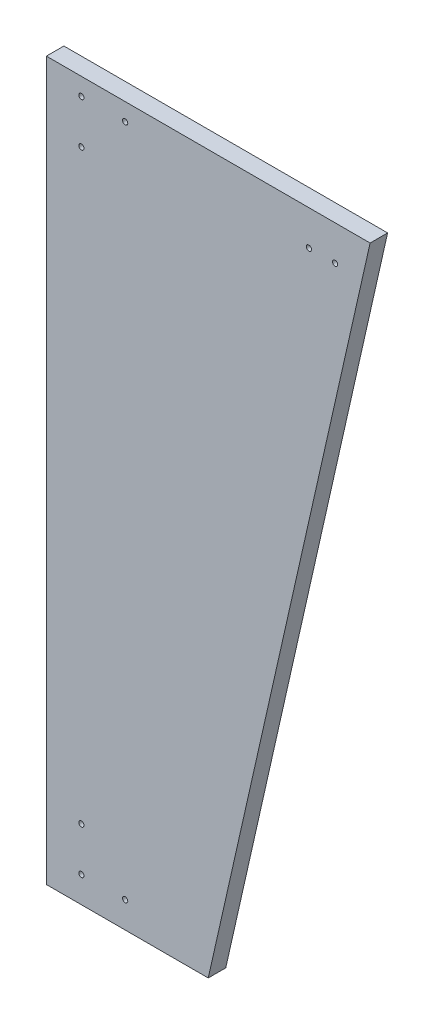
ISO-10303-21;
HEADER;
FILE_DESCRIPTION(('STEP AP214'),'2;1');
FILE_NAME('part.step','',(''),(''),'','','');
FILE_SCHEMA(('AUTOMOTIVE_DESIGN { 1 0 10303 214 1 1 1 1 }'));
ENDSEC;
DATA;
#1=APPLICATION_CONTEXT('core data for automotive mechanical design processes');
#2=APPLICATION_PROTOCOL_DEFINITION('international standard','automotive_design',2000,#1);
#3=PRODUCT_CONTEXT('',#1,'mechanical');
#4=PRODUCT('Part','Part','',(#3));
#5=PRODUCT_RELATED_PRODUCT_CATEGORY('part','',(#4));
#6=PRODUCT_DEFINITION_FORMATION('','',#4);
#7=PRODUCT_DEFINITION_CONTEXT('part definition',#1,'design');
#8=PRODUCT_DEFINITION('design','',#6,#7);
#9=PRODUCT_DEFINITION_SHAPE('','',#8);
#10=(LENGTH_UNIT() NAMED_UNIT(*) SI_UNIT(.MILLI.,.METRE.));
#11=(NAMED_UNIT(*) PLANE_ANGLE_UNIT() SI_UNIT($,.RADIAN.));
#12=(NAMED_UNIT(*) SI_UNIT($,.STERADIAN.) SOLID_ANGLE_UNIT());
#13=UNCERTAINTY_MEASURE_WITH_UNIT(LENGTH_MEASURE(1.E-05),#10,'distance_accuracy_value','');
#14=(GEOMETRIC_REPRESENTATION_CONTEXT(3) GLOBAL_UNCERTAINTY_ASSIGNED_CONTEXT((#13)) GLOBAL_UNIT_ASSIGNED_CONTEXT((#10,
#11,#12)) REPRESENTATION_CONTEXT('',''));
#15=CARTESIAN_POINT('',(0.,0.,0.));
#16=DIRECTION('',(0.,0.,1.));
#17=DIRECTION('',(1.,0.,0.));
#18=AXIS2_PLACEMENT_3D('',#15,#16,#17);
#19=CARTESIAN_POINT('',(0.,-410.,10.));
#20=DIRECTION('',(0.,1.,0.));
#21=DIRECTION('',(0.,0.,1.));
#22=AXIS2_PLACEMENT_3D('',#19,#20,#21);
#23=PLANE('',#22);
#24=DIRECTION('',(1.,0.,0.));
#25=VECTOR('',#24,1.);
#26=CARTESIAN_POINT('',(0.,-410.,0.));
#27=LINE('',#26,#25);
#28=CARTESIAN_POINT('',(-1.95821023183662E-12,-410.,0.));
#29=VERTEX_POINT('',#28);
#30=CARTESIAN_POINT('',(92.5,-410.,0.));
#31=VERTEX_POINT('',#30);
#32=EDGE_CURVE('E103',#29,#31,#27,.T.);
#33=ORIENTED_EDGE('',*,*,#32,.T.);
#34=DIRECTION('',(0.,0.,-1.));
#35=VECTOR('',#34,1.);
#36=CARTESIAN_POINT('',(92.5,-410.,10.));
#37=LINE('',#36,#35);
#38=CARTESIAN_POINT('',(92.5,-410.,10.));
#39=VERTEX_POINT('',#38);
#40=EDGE_CURVE('E11',#39,#31,#37,.T.);
#41=ORIENTED_EDGE('',*,*,#40,.F.);
#42=DIRECTION('',(1.,0.,0.));
#43=VECTOR('',#42,1.);
#44=CARTESIAN_POINT('',(0.,-410.,10.));
#45=LINE('',#44,#43);
#46=CARTESIAN_POINT('',(-1.95821023183662E-12,-410.,10.));
#47=VERTEX_POINT('',#46);
#48=EDGE_CURVE('E88',#47,#39,#45,.T.);
#49=ORIENTED_EDGE('',*,*,#48,.F.);
#50=DIRECTION('',(0.,0.,-1.));
#51=VECTOR('',#50,1.);
#52=CARTESIAN_POINT('',(-1.95821023183662E-12,-410.,10.));
#53=LINE('',#52,#51);
#54=EDGE_CURVE('E99',#47,#29,#53,.T.);
#55=ORIENTED_EDGE('',*,*,#54,.T.);
#56=EDGE_LOOP('',(#33,#41,#49,#55));
#57=FACE_BOUND('',#56,.T.);
#58=ADVANCED_FACE('F41',(#57),#23,.F.);
#59=CARTESIAN_POINT('',(176.039624977888,-39.7162568547674,10.));
#60=DIRECTION('',(-0.97548220917709,0.220078303289953,0.));
#61=DIRECTION('',(-0.220078303289953,-0.97548220917709,0.));
#62=AXIS2_PLACEMENT_3D('',#59,#60,#61);
#63=PLANE('',#62);
#64=DIRECTION('',(0.220078303289953,0.97548220917709,0.));
#65=VECTOR('',#64,1.);
#66=CARTESIAN_POINT('',(176.039624977888,-39.7162568547674,0.));
#67=LINE('',#66,#65);
#68=CARTESIAN_POINT('',(185.,0.,0.));
#69=VERTEX_POINT('',#68);
#70=EDGE_CURVE('E93',#31,#69,#67,.T.);
#71=ORIENTED_EDGE('',*,*,#70,.T.);
#72=DIRECTION('',(0.,0.,-1.));
#73=VECTOR('',#72,1.);
#74=CARTESIAN_POINT('',(185.,0.,10.));
#75=LINE('',#74,#73);
#76=CARTESIAN_POINT('',(185.,0.,10.));
#77=VERTEX_POINT('',#76);
#78=EDGE_CURVE('E49',#77,#69,#75,.T.);
#79=ORIENTED_EDGE('',*,*,#78,.F.);
#80=DIRECTION('',(0.220078303289953,0.97548220917709,0.));
#81=VECTOR('',#80,1.);
#82=CARTESIAN_POINT('',(176.039624977888,-39.7162568547674,10.));
#83=LINE('',#82,#81);
#84=EDGE_CURVE('E83',#39,#77,#83,.T.);
#85=ORIENTED_EDGE('',*,*,#84,.F.);
#86=ORIENTED_EDGE('',*,*,#40,.T.);
#87=EDGE_LOOP('',(#71,#79,#85,#86));
#88=FACE_BOUND('',#87,.T.);
#89=ADVANCED_FACE('F92',(#88),#63,.F.);
#90=CARTESIAN_POINT('',(0.,0.,10.));
#91=DIRECTION('',(0.,1.,0.));
#92=DIRECTION('',(0.,0.,1.));
#93=AXIS2_PLACEMENT_3D('',#90,#91,#92);
#94=PLANE('',#93);
#95=DIRECTION('',(1.,0.,0.));
#96=VECTOR('',#95,1.);
#97=CARTESIAN_POINT('',(0.,0.,0.));
#98=LINE('',#97,#96);
#99=CARTESIAN_POINT('',(0.,0.,0.));
#100=VERTEX_POINT('',#99);
#101=EDGE_CURVE('E108',#100,#69,#98,.T.);
#102=ORIENTED_EDGE('',*,*,#101,.F.);
#103=DIRECTION('',(0.,0.,-1.));
#104=VECTOR('',#103,1.);
#105=CARTESIAN_POINT('',(0.,0.,10.));
#106=LINE('',#105,#104);
#107=CARTESIAN_POINT('',(0.,0.,10.));
#108=VERTEX_POINT('',#107);
#109=EDGE_CURVE('E73',#108,#100,#106,.T.);
#110=ORIENTED_EDGE('',*,*,#109,.F.);
#111=DIRECTION('',(1.,0.,0.));
#112=VECTOR('',#111,1.);
#113=CARTESIAN_POINT('',(0.,0.,10.));
#114=LINE('',#113,#112);
#115=EDGE_CURVE('E86',#108,#77,#114,.T.);
#116=ORIENTED_EDGE('',*,*,#115,.T.);
#117=ORIENTED_EDGE('',*,*,#78,.T.);
#118=EDGE_LOOP('',(#102,#110,#116,#117));
#119=FACE_BOUND('',#118,.T.);
#120=ADVANCED_FACE('F97',(#119),#94,.T.);
#121=CARTESIAN_POINT('',(0.,0.,10.));
#122=DIRECTION('',(1.,0.,0.));
#123=DIRECTION('',(0.,1.,0.));
#124=AXIS2_PLACEMENT_3D('',#121,#122,#123);
#125=PLANE('',#124);
#126=DIRECTION('',(0.,-1.,0.));
#127=VECTOR('',#126,1.);
#128=CARTESIAN_POINT('',(0.,0.,0.));
#129=LINE('',#128,#127);
#130=EDGE_CURVE('E76',#100,#29,#129,.T.);
#131=ORIENTED_EDGE('',*,*,#130,.T.);
#132=ORIENTED_EDGE('',*,*,#54,.F.);
#133=DIRECTION('',(0.,-1.,0.));
#134=VECTOR('',#133,1.);
#135=CARTESIAN_POINT('',(0.,0.,10.));
#136=LINE('',#135,#134);
#137=EDGE_CURVE('E57',#108,#47,#136,.T.);
#138=ORIENTED_EDGE('',*,*,#137,.F.);
#139=ORIENTED_EDGE('',*,*,#109,.T.);
#140=EDGE_LOOP('',(#131,#132,#138,#139));
#141=FACE_BOUND('',#140,.T.);
#142=ADVANCED_FACE('F128',(#141),#125,.F.);
#143=CARTESIAN_POINT('',(0.,0.,10.));
#144=DIRECTION('',(0.,0.,1.));
#145=DIRECTION('',(1.,0.,0.));
#146=AXIS2_PLACEMENT_3D('',#143,#144,#145);
#147=PLANE('',#146);
#148=CARTESIAN_POINT('',(165.,-20.,10.));
#149=DIRECTION('',(0.,0.,-1.));
#150=DIRECTION('',(-1.,0.,0.));
#151=AXIS2_PLACEMENT_3D('',#148,#149,#150);
#152=CIRCLE('',#151,1.5);
#153=CARTESIAN_POINT('',(163.5,-20.,10.));
#154=VERTEX_POINT('',#153);
#155=EDGE_CURVE('E238',#154,#154,#152,.T.);
#156=ORIENTED_EDGE('',*,*,#155,.T.);
#157=EDGE_LOOP('',(#156));
#158=FACE_BOUND('',#157,.T.);
#159=CARTESIAN_POINT('',(150.,-20.,10.));
#160=DIRECTION('',(0.,0.,-1.));
#161=DIRECTION('',(-1.,0.,0.));
#162=AXIS2_PLACEMENT_3D('',#159,#160,#161);
#163=CIRCLE('',#162,1.5);
#164=CARTESIAN_POINT('',(148.5,-20.,10.));
#165=VERTEX_POINT('',#164);
#166=EDGE_CURVE('E241',#165,#165,#163,.T.);
#167=ORIENTED_EDGE('',*,*,#166,.T.);
#168=EDGE_LOOP('',(#167));
#169=FACE_BOUND('',#168,.T.);
#170=CARTESIAN_POINT('',(45.,-10.,10.));
#171=DIRECTION('',(0.,0.,1.));
#172=DIRECTION('',(1.,0.,0.));
#173=AXIS2_PLACEMENT_3D('',#170,#171,#172);
#174=CIRCLE('',#173,1.5);
#175=CARTESIAN_POINT('',(46.5,-10.,10.));
#176=VERTEX_POINT('',#175);
#177=EDGE_CURVE('E261',#176,#176,#174,.T.);
#178=ORIENTED_EDGE('',*,*,#177,.F.);
#179=EDGE_LOOP('',(#178));
#180=FACE_BOUND('',#179,.T.);
#181=CARTESIAN_POINT('',(20.,-10.,10.));
#182=DIRECTION('',(0.,0.,1.));
#183=DIRECTION('',(1.,0.,0.));
#184=AXIS2_PLACEMENT_3D('',#181,#182,#183);
#185=CIRCLE('',#184,1.5);
#186=CARTESIAN_POINT('',(21.5,-10.,10.));
#187=VERTEX_POINT('',#186);
#188=EDGE_CURVE('E267',#187,#187,#185,.T.);
#189=ORIENTED_EDGE('',*,*,#188,.F.);
#190=EDGE_LOOP('',(#189));
#191=FACE_BOUND('',#190,.T.);
#192=CARTESIAN_POINT('',(45.,-395.,10.));
#193=DIRECTION('',(0.,0.,1.));
#194=DIRECTION('',(1.,0.,0.));
#195=AXIS2_PLACEMENT_3D('',#192,#193,#194);
#196=CIRCLE('',#195,1.5);
#197=CARTESIAN_POINT('',(46.5,-395.,10.));
#198=VERTEX_POINT('',#197);
#199=EDGE_CURVE('E273',#198,#198,#196,.T.);
#200=ORIENTED_EDGE('',*,*,#199,.F.);
#201=EDGE_LOOP('',(#200));
#202=FACE_BOUND('',#201,.T.);
#203=CARTESIAN_POINT('',(20.,-395.,10.));
#204=DIRECTION('',(0.,0.,1.));
#205=DIRECTION('',(1.,0.,0.));
#206=AXIS2_PLACEMENT_3D('',#203,#204,#205);
#207=CIRCLE('',#206,1.5);
#208=CARTESIAN_POINT('',(21.5,-395.,10.));
#209=VERTEX_POINT('',#208);
#210=EDGE_CURVE('E254',#209,#209,#207,.T.);
#211=ORIENTED_EDGE('',*,*,#210,.F.);
#212=EDGE_LOOP('',(#211));
#213=FACE_BOUND('',#212,.T.);
#214=CARTESIAN_POINT('',(20.,-370.,10.));
#215=DIRECTION('',(0.,0.,1.));
#216=DIRECTION('',(1.,0.,0.));
#217=AXIS2_PLACEMENT_3D('',#214,#215,#216);
#218=CIRCLE('',#217,1.5);
#219=CARTESIAN_POINT('',(21.5,-370.,10.));
#220=VERTEX_POINT('',#219);
#221=EDGE_CURVE('E243',#220,#220,#218,.T.);
#222=ORIENTED_EDGE('',*,*,#221,.F.);
#223=EDGE_LOOP('',(#222));
#224=FACE_BOUND('',#223,.T.);
#225=CARTESIAN_POINT('',(20.,-35.,10.));
#226=DIRECTION('',(0.,0.,1.));
#227=DIRECTION('',(1.,0.,0.));
#228=AXIS2_PLACEMENT_3D('',#225,#226,#227);
#229=CIRCLE('',#228,1.5);
#230=CARTESIAN_POINT('',(21.5,-35.,10.));
#231=VERTEX_POINT('',#230);
#232=EDGE_CURVE('E260',#231,#231,#229,.T.);
#233=ORIENTED_EDGE('',*,*,#232,.F.);
#234=EDGE_LOOP('',(#233));
#235=FACE_BOUND('',#234,.T.);
#236=ORIENTED_EDGE('',*,*,#48,.T.);
#237=ORIENTED_EDGE('',*,*,#84,.T.);
#238=ORIENTED_EDGE('',*,*,#115,.F.);
#239=ORIENTED_EDGE('',*,*,#137,.T.);
#240=EDGE_LOOP('',(#236,#237,#238,#239));
#241=FACE_BOUND('',#240,.T.);
#242=ADVANCED_FACE('F84',(#158,#169,#180,#191,#202,#213,#224,#235,#241),#147,.T.);
#243=CARTESIAN_POINT('',(0.,0.,0.));
#244=DIRECTION('',(0.,0.,1.));
#245=DIRECTION('',(1.,0.,0.));
#246=AXIS2_PLACEMENT_3D('',#243,#244,#245);
#247=PLANE('',#246);
#248=CARTESIAN_POINT('',(165.,-20.,0.));
#249=DIRECTION('',(0.,0.,-1.));
#250=DIRECTION('',(-1.,0.,0.));
#251=AXIS2_PLACEMENT_3D('',#248,#249,#250);
#252=CIRCLE('',#251,1.5);
#253=CARTESIAN_POINT('',(163.5,-20.,0.));
#254=VERTEX_POINT('',#253);
#255=EDGE_CURVE('E240',#254,#254,#252,.T.);
#256=ORIENTED_EDGE('',*,*,#255,.F.);
#257=EDGE_LOOP('',(#256));
#258=FACE_BOUND('',#257,.T.);
#259=CARTESIAN_POINT('',(150.,-20.,0.));
#260=DIRECTION('',(0.,0.,-1.));
#261=DIRECTION('',(-1.,0.,0.));
#262=AXIS2_PLACEMENT_3D('',#259,#260,#261);
#263=CIRCLE('',#262,1.5);
#264=CARTESIAN_POINT('',(148.5,-20.,0.));
#265=VERTEX_POINT('',#264);
#266=EDGE_CURVE('E246',#265,#265,#263,.T.);
#267=ORIENTED_EDGE('',*,*,#266,.F.);
#268=EDGE_LOOP('',(#267));
#269=FACE_BOUND('',#268,.T.);
#270=CARTESIAN_POINT('',(45.,-10.,0.));
#271=DIRECTION('',(0.,0.,1.));
#272=DIRECTION('',(1.,0.,0.));
#273=AXIS2_PLACEMENT_3D('',#270,#271,#272);
#274=CIRCLE('',#273,1.5);
#275=CARTESIAN_POINT('',(46.5,-10.,0.));
#276=VERTEX_POINT('',#275);
#277=EDGE_CURVE('E257',#276,#276,#274,.T.);
#278=ORIENTED_EDGE('',*,*,#277,.T.);
#279=EDGE_LOOP('',(#278));
#280=FACE_BOUND('',#279,.T.);
#281=CARTESIAN_POINT('',(20.,-10.,0.));
#282=DIRECTION('',(0.,0.,1.));
#283=DIRECTION('',(1.,0.,0.));
#284=AXIS2_PLACEMENT_3D('',#281,#282,#283);
#285=CIRCLE('',#284,1.5);
#286=CARTESIAN_POINT('',(21.5,-10.,0.));
#287=VERTEX_POINT('',#286);
#288=EDGE_CURVE('E264',#287,#287,#285,.T.);
#289=ORIENTED_EDGE('',*,*,#288,.T.);
#290=EDGE_LOOP('',(#289));
#291=FACE_BOUND('',#290,.T.);
#292=CARTESIAN_POINT('',(45.,-395.,0.));
#293=DIRECTION('',(0.,0.,1.));
#294=DIRECTION('',(1.,0.,0.));
#295=AXIS2_PLACEMENT_3D('',#292,#293,#294);
#296=CIRCLE('',#295,1.5);
#297=CARTESIAN_POINT('',(46.5,-395.,0.));
#298=VERTEX_POINT('',#297);
#299=EDGE_CURVE('E270',#298,#298,#296,.T.);
#300=ORIENTED_EDGE('',*,*,#299,.T.);
#301=EDGE_LOOP('',(#300));
#302=FACE_BOUND('',#301,.T.);
#303=CARTESIAN_POINT('',(20.,-395.,0.));
#304=DIRECTION('',(0.,0.,1.));
#305=DIRECTION('',(1.,0.,0.));
#306=AXIS2_PLACEMENT_3D('',#303,#304,#305);
#307=CIRCLE('',#306,1.5);
#308=CARTESIAN_POINT('',(21.5,-395.,0.));
#309=VERTEX_POINT('',#308);
#310=EDGE_CURVE('E276',#309,#309,#307,.T.);
#311=ORIENTED_EDGE('',*,*,#310,.T.);
#312=EDGE_LOOP('',(#311));
#313=FACE_BOUND('',#312,.T.);
#314=CARTESIAN_POINT('',(20.,-370.,0.));
#315=DIRECTION('',(0.,0.,1.));
#316=DIRECTION('',(1.,0.,0.));
#317=AXIS2_PLACEMENT_3D('',#314,#315,#316);
#318=CIRCLE('',#317,1.5);
#319=CARTESIAN_POINT('',(21.5,-370.,0.));
#320=VERTEX_POINT('',#319);
#321=EDGE_CURVE('E251',#320,#320,#318,.T.);
#322=ORIENTED_EDGE('',*,*,#321,.T.);
#323=EDGE_LOOP('',(#322));
#324=FACE_BOUND('',#323,.T.);
#325=CARTESIAN_POINT('',(20.,-35.,0.));
#326=DIRECTION('',(0.,0.,1.));
#327=DIRECTION('',(1.,0.,0.));
#328=AXIS2_PLACEMENT_3D('',#325,#326,#327);
#329=CIRCLE('',#328,1.5);
#330=CARTESIAN_POINT('',(21.5,-35.,0.));
#331=VERTEX_POINT('',#330);
#332=EDGE_CURVE('E106',#331,#331,#329,.T.);
#333=ORIENTED_EDGE('',*,*,#332,.T.);
#334=EDGE_LOOP('',(#333));
#335=FACE_BOUND('',#334,.T.);
#336=ORIENTED_EDGE('',*,*,#32,.F.);
#337=ORIENTED_EDGE('',*,*,#130,.F.);
#338=ORIENTED_EDGE('',*,*,#101,.T.);
#339=ORIENTED_EDGE('',*,*,#70,.F.);
#340=EDGE_LOOP('',(#336,#337,#338,#339));
#341=FACE_BOUND('',#340,.T.);
#342=ADVANCED_FACE('F115',(#258,#269,#280,#291,#302,#313,#324,#335,#341),#247,.F.);
#343=CARTESIAN_POINT('',(20.,-35.,0.));
#344=DIRECTION('',(0.,0.,1.));
#345=DIRECTION('',(1.,0.,0.));
#346=AXIS2_PLACEMENT_3D('',#343,#344,#345);
#347=CYLINDRICAL_SURFACE('',#346,1.5);
#348=ORIENTED_EDGE('',*,*,#332,.F.);
#349=EDGE_LOOP('',(#348));
#350=FACE_BOUND('',#349,.T.);
#351=ORIENTED_EDGE('',*,*,#232,.T.);
#352=EDGE_LOOP('',(#351));
#353=FACE_BOUND('',#352,.T.);
#354=ADVANCED_FACE('F117',(#350,#353),#347,.F.);
#355=CARTESIAN_POINT('',(20.,-370.,0.));
#356=DIRECTION('',(0.,0.,1.));
#357=DIRECTION('',(1.,0.,0.));
#358=AXIS2_PLACEMENT_3D('',#355,#356,#357);
#359=CYLINDRICAL_SURFACE('',#358,1.5);
#360=ORIENTED_EDGE('',*,*,#321,.F.);
#361=EDGE_LOOP('',(#360));
#362=FACE_BOUND('',#361,.T.);
#363=ORIENTED_EDGE('',*,*,#221,.T.);
#364=EDGE_LOOP('',(#363));
#365=FACE_BOUND('',#364,.T.);
#366=ADVANCED_FACE('F125',(#362,#365),#359,.F.);
#367=CARTESIAN_POINT('',(20.,-395.,0.));
#368=DIRECTION('',(0.,0.,1.));
#369=DIRECTION('',(1.,0.,0.));
#370=AXIS2_PLACEMENT_3D('',#367,#368,#369);
#371=CYLINDRICAL_SURFACE('',#370,1.5);
#372=ORIENTED_EDGE('',*,*,#310,.F.);
#373=EDGE_LOOP('',(#372));
#374=FACE_BOUND('',#373,.T.);
#375=ORIENTED_EDGE('',*,*,#210,.T.);
#376=EDGE_LOOP('',(#375));
#377=FACE_BOUND('',#376,.T.);
#378=ADVANCED_FACE('F170',(#374,#377),#371,.F.);
#379=CARTESIAN_POINT('',(45.,-395.,0.));
#380=DIRECTION('',(0.,0.,1.));
#381=DIRECTION('',(1.,0.,0.));
#382=AXIS2_PLACEMENT_3D('',#379,#380,#381);
#383=CYLINDRICAL_SURFACE('',#382,1.5);
#384=ORIENTED_EDGE('',*,*,#299,.F.);
#385=EDGE_LOOP('',(#384));
#386=FACE_BOUND('',#385,.T.);
#387=ORIENTED_EDGE('',*,*,#199,.T.);
#388=EDGE_LOOP('',(#387));
#389=FACE_BOUND('',#388,.T.);
#390=ADVANCED_FACE('F178',(#386,#389),#383,.F.);
#391=CARTESIAN_POINT('',(20.,-10.,0.));
#392=DIRECTION('',(0.,0.,1.));
#393=DIRECTION('',(1.,0.,0.));
#394=AXIS2_PLACEMENT_3D('',#391,#392,#393);
#395=CYLINDRICAL_SURFACE('',#394,1.5);
#396=ORIENTED_EDGE('',*,*,#288,.F.);
#397=EDGE_LOOP('',(#396));
#398=FACE_BOUND('',#397,.T.);
#399=ORIENTED_EDGE('',*,*,#188,.T.);
#400=EDGE_LOOP('',(#399));
#401=FACE_BOUND('',#400,.T.);
#402=ADVANCED_FACE('F186',(#398,#401),#395,.F.);
#403=CARTESIAN_POINT('',(45.,-10.,0.));
#404=DIRECTION('',(0.,0.,1.));
#405=DIRECTION('',(1.,0.,0.));
#406=AXIS2_PLACEMENT_3D('',#403,#404,#405);
#407=CYLINDRICAL_SURFACE('',#406,1.5);
#408=ORIENTED_EDGE('',*,*,#277,.F.);
#409=EDGE_LOOP('',(#408));
#410=FACE_BOUND('',#409,.T.);
#411=ORIENTED_EDGE('',*,*,#177,.T.);
#412=EDGE_LOOP('',(#411));
#413=FACE_BOUND('',#412,.T.);
#414=ADVANCED_FACE('F194',(#410,#413),#407,.F.);
#415=CARTESIAN_POINT('',(150.,-20.,10.));
#416=DIRECTION('',(0.,0.,-1.));
#417=DIRECTION('',(-1.,0.,0.));
#418=AXIS2_PLACEMENT_3D('',#415,#416,#417);
#419=CYLINDRICAL_SURFACE('',#418,1.5);
#420=ORIENTED_EDGE('',*,*,#166,.F.);
#421=EDGE_LOOP('',(#420));
#422=FACE_BOUND('',#421,.T.);
#423=ORIENTED_EDGE('',*,*,#266,.T.);
#424=EDGE_LOOP('',(#423));
#425=FACE_BOUND('',#424,.T.);
#426=ADVANCED_FACE('F201',(#422,#425),#419,.F.);
#427=CARTESIAN_POINT('',(165.,-20.,10.));
#428=DIRECTION('',(0.,0.,-1.));
#429=DIRECTION('',(-1.,0.,0.));
#430=AXIS2_PLACEMENT_3D('',#427,#428,#429);
#431=CYLINDRICAL_SURFACE('',#430,1.5);
#432=ORIENTED_EDGE('',*,*,#155,.F.);
#433=EDGE_LOOP('',(#432));
#434=FACE_BOUND('',#433,.T.);
#435=ORIENTED_EDGE('',*,*,#255,.T.);
#436=EDGE_LOOP('',(#435));
#437=FACE_BOUND('',#436,.T.);
#438=ADVANCED_FACE('F208',(#434,#437),#431,.F.);
#439=CLOSED_SHELL('',(#58,#89,#120,#142,#242,#342,#354,#366,#378,#390,#402,#414,#426,#438));
#440=MANIFOLD_SOLID_BREP('B2',#439);
#441=ADVANCED_BREP_SHAPE_REPRESENTATION('',(#18,#440),#14);
#442=SHAPE_DEFINITION_REPRESENTATION(#9,#441);
ENDSEC;
END-ISO-10303-21;
